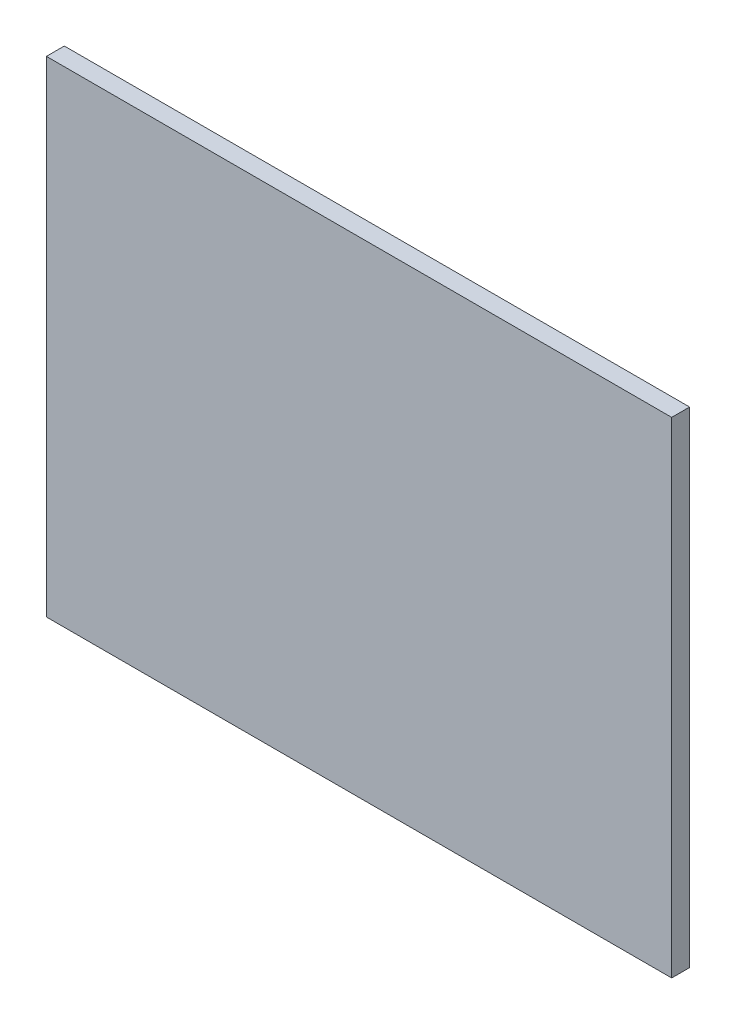
ISO-10303-21;
HEADER;
FILE_DESCRIPTION(('STEP AP214'),'2;1');
FILE_NAME('part.step','',(''),(''),'','','');
FILE_SCHEMA(('AUTOMOTIVE_DESIGN { 1 0 10303 214 1 1 1 1 }'));
ENDSEC;
DATA;
#1=APPLICATION_CONTEXT('core data for automotive mechanical design processes');
#2=APPLICATION_PROTOCOL_DEFINITION('international standard','automotive_design',2000,#1);
#3=PRODUCT_CONTEXT('',#1,'mechanical');
#4=PRODUCT('Part','Part','',(#3));
#5=PRODUCT_RELATED_PRODUCT_CATEGORY('part','',(#4));
#6=PRODUCT_DEFINITION_FORMATION('','',#4);
#7=PRODUCT_DEFINITION_CONTEXT('part definition',#1,'design');
#8=PRODUCT_DEFINITION('design','',#6,#7);
#9=PRODUCT_DEFINITION_SHAPE('','',#8);
#10=(LENGTH_UNIT() NAMED_UNIT(*) SI_UNIT(.MILLI.,.METRE.));
#11=(NAMED_UNIT(*) PLANE_ANGLE_UNIT() SI_UNIT($,.RADIAN.));
#12=(NAMED_UNIT(*) SI_UNIT($,.STERADIAN.) SOLID_ANGLE_UNIT());
#13=UNCERTAINTY_MEASURE_WITH_UNIT(LENGTH_MEASURE(1.E-05),#10,'distance_accuracy_value','');
#14=(GEOMETRIC_REPRESENTATION_CONTEXT(3) GLOBAL_UNCERTAINTY_ASSIGNED_CONTEXT((#13)) GLOBAL_UNIT_ASSIGNED_CONTEXT((#10,
#11,#12)) REPRESENTATION_CONTEXT('',''));
#15=CARTESIAN_POINT('',(0.,0.,0.));
#16=DIRECTION('',(0.,0.,1.));
#17=DIRECTION('',(1.,0.,0.));
#18=AXIS2_PLACEMENT_3D('',#15,#16,#17);
#19=CARTESIAN_POINT('',(0.,0.,2.));
#20=DIRECTION('',(1.,0.,0.));
#21=DIRECTION('',(0.,0.,-1.));
#22=AXIS2_PLACEMENT_3D('',#19,#20,#21);
#23=PLANE('',#22);
#24=DIRECTION('',(0.,-1.,0.));
#25=VECTOR('',#24,1.);
#26=CARTESIAN_POINT('',(0.,0.,0.));
#27=LINE('',#26,#25);
#28=CARTESIAN_POINT('',(0.,54.2,0.));
#29=VERTEX_POINT('',#28);
#30=CARTESIAN_POINT('',(0.,0.,0.));
#31=VERTEX_POINT('',#30);
#32=EDGE_CURVE('E97',#29,#31,#27,.T.);
#33=ORIENTED_EDGE('',*,*,#32,.T.);
#34=DIRECTION('',(0.,0.,-1.));
#35=VECTOR('',#34,1.);
#36=CARTESIAN_POINT('',(0.,0.,2.));
#37=LINE('',#36,#35);
#38=CARTESIAN_POINT('',(0.,0.,2.));
#39=VERTEX_POINT('',#38);
#40=EDGE_CURVE('E11',#39,#31,#37,.T.);
#41=ORIENTED_EDGE('',*,*,#40,.F.);
#42=DIRECTION('',(0.,-1.,0.));
#43=VECTOR('',#42,1.);
#44=CARTESIAN_POINT('',(0.,0.,2.));
#45=LINE('',#44,#43);
#46=CARTESIAN_POINT('',(0.,54.2,2.));
#47=VERTEX_POINT('',#46);
#48=EDGE_CURVE('E85',#47,#39,#45,.T.);
#49=ORIENTED_EDGE('',*,*,#48,.F.);
#50=DIRECTION('',(0.,0.,-1.));
#51=VECTOR('',#50,1.);
#52=CARTESIAN_POINT('',(0.,54.2,2.));
#53=LINE('',#52,#51);
#54=EDGE_CURVE('E93',#47,#29,#53,.T.);
#55=ORIENTED_EDGE('',*,*,#54,.T.);
#56=EDGE_LOOP('',(#33,#41,#49,#55));
#57=FACE_BOUND('',#56,.T.);
#58=ADVANCED_FACE('F34',(#57),#23,.F.);
#59=CARTESIAN_POINT('',(0.,0.,2.));
#60=DIRECTION('',(0.,1.,0.));
#61=DIRECTION('',(0.,0.,1.));
#62=AXIS2_PLACEMENT_3D('',#59,#60,#61);
#63=PLANE('',#62);
#64=DIRECTION('',(1.,0.,0.));
#65=VECTOR('',#64,1.);
#66=CARTESIAN_POINT('',(0.,0.,0.));
#67=LINE('',#66,#65);
#68=CARTESIAN_POINT('',(69.8,0.,0.));
#69=VERTEX_POINT('',#68);
#70=EDGE_CURVE('E89',#31,#69,#67,.T.);
#71=ORIENTED_EDGE('',*,*,#70,.T.);
#72=DIRECTION('',(0.,0.,-1.));
#73=VECTOR('',#72,1.);
#74=CARTESIAN_POINT('',(69.8,0.,2.));
#75=LINE('',#74,#73);
#76=CARTESIAN_POINT('',(69.8,0.,2.));
#77=VERTEX_POINT('',#76);
#78=EDGE_CURVE('E42',#77,#69,#75,.T.);
#79=ORIENTED_EDGE('',*,*,#78,.F.);
#80=DIRECTION('',(1.,0.,0.));
#81=VECTOR('',#80,1.);
#82=CARTESIAN_POINT('',(0.,0.,2.));
#83=LINE('',#82,#81);
#84=EDGE_CURVE('E80',#39,#77,#83,.T.);
#85=ORIENTED_EDGE('',*,*,#84,.F.);
#86=ORIENTED_EDGE('',*,*,#40,.T.);
#87=EDGE_LOOP('',(#71,#79,#85,#86));
#88=FACE_BOUND('',#87,.T.);
#89=ADVANCED_FACE('F88',(#88),#63,.F.);
#90=CARTESIAN_POINT('',(69.8,0.,2.));
#91=DIRECTION('',(-1.,0.,0.));
#92=DIRECTION('',(0.,0.,1.));
#93=AXIS2_PLACEMENT_3D('',#90,#91,#92);
#94=PLANE('',#93);
#95=DIRECTION('',(0.,1.,0.));
#96=VECTOR('',#95,1.);
#97=CARTESIAN_POINT('',(69.8,0.,0.));
#98=LINE('',#97,#96);
#99=CARTESIAN_POINT('',(69.8,54.2,0.));
#100=VERTEX_POINT('',#99);
#101=EDGE_CURVE('E67',#69,#100,#98,.T.);
#102=ORIENTED_EDGE('',*,*,#101,.T.);
#103=DIRECTION('',(0.,0.,-1.));
#104=VECTOR('',#103,1.);
#105=CARTESIAN_POINT('',(69.8,54.2,2.));
#106=LINE('',#105,#104);
#107=CARTESIAN_POINT('',(69.8,54.2,2.));
#108=VERTEX_POINT('',#107);
#109=EDGE_CURVE('E90',#108,#100,#106,.T.);
#110=ORIENTED_EDGE('',*,*,#109,.F.);
#111=DIRECTION('',(0.,1.,0.));
#112=VECTOR('',#111,1.);
#113=CARTESIAN_POINT('',(69.8,0.,2.));
#114=LINE('',#113,#112);
#115=EDGE_CURVE('E83',#77,#108,#114,.T.);
#116=ORIENTED_EDGE('',*,*,#115,.F.);
#117=ORIENTED_EDGE('',*,*,#78,.T.);
#118=EDGE_LOOP('',(#102,#110,#116,#117));
#119=FACE_BOUND('',#118,.T.);
#120=ADVANCED_FACE('F91',(#119),#94,.F.);
#121=CARTESIAN_POINT('',(0.,54.2,2.));
#122=DIRECTION('',(0.,-1.,0.));
#123=DIRECTION('',(0.,0.,-1.));
#124=AXIS2_PLACEMENT_3D('',#121,#122,#123);
#125=PLANE('',#124);
#126=DIRECTION('',(-1.,0.,0.));
#127=VECTOR('',#126,1.);
#128=CARTESIAN_POINT('',(0.,54.2,0.));
#129=LINE('',#128,#127);
#130=EDGE_CURVE('E73',#100,#29,#129,.T.);
#131=ORIENTED_EDGE('',*,*,#130,.T.);
#132=ORIENTED_EDGE('',*,*,#54,.F.);
#133=DIRECTION('',(-1.,0.,0.));
#134=VECTOR('',#133,1.);
#135=CARTESIAN_POINT('',(0.,54.2,2.));
#136=LINE('',#135,#134);
#137=EDGE_CURVE('E50',#108,#47,#136,.T.);
#138=ORIENTED_EDGE('',*,*,#137,.F.);
#139=ORIENTED_EDGE('',*,*,#109,.T.);
#140=EDGE_LOOP('',(#131,#132,#138,#139));
#141=FACE_BOUND('',#140,.T.);
#142=ADVANCED_FACE('F104',(#141),#125,.F.);
#143=CARTESIAN_POINT('',(0.,0.,2.));
#144=DIRECTION('',(0.,0.,-1.));
#145=DIRECTION('',(-1.,0.,0.));
#146=AXIS2_PLACEMENT_3D('',#143,#144,#145);
#147=PLANE('',#146);
#148=ORIENTED_EDGE('',*,*,#48,.T.);
#149=ORIENTED_EDGE('',*,*,#84,.T.);
#150=ORIENTED_EDGE('',*,*,#115,.T.);
#151=ORIENTED_EDGE('',*,*,#137,.T.);
#152=EDGE_LOOP('',(#148,#149,#150,#151));
#153=FACE_BOUND('',#152,.T.);
#154=ADVANCED_FACE('F81',(#153),#147,.F.);
#155=CARTESIAN_POINT('',(0.,0.,0.));
#156=DIRECTION('',(0.,0.,-1.));
#157=DIRECTION('',(-1.,0.,0.));
#158=AXIS2_PLACEMENT_3D('',#155,#156,#157);
#159=PLANE('',#158);
#160=ORIENTED_EDGE('',*,*,#32,.F.);
#161=ORIENTED_EDGE('',*,*,#130,.F.);
#162=ORIENTED_EDGE('',*,*,#101,.F.);
#163=ORIENTED_EDGE('',*,*,#70,.F.);
#164=EDGE_LOOP('',(#160,#161,#162,#163));
#165=FACE_BOUND('',#164,.T.);
#166=ADVANCED_FACE('F107',(#165),#159,.T.);
#167=CLOSED_SHELL('',(#58,#89,#120,#142,#154,#166));
#168=MANIFOLD_SOLID_BREP('B2',#167);
#169=ADVANCED_BREP_SHAPE_REPRESENTATION('',(#18,#168),#14);
#170=SHAPE_DEFINITION_REPRESENTATION(#9,#169);
ENDSEC;
END-ISO-10303-21;
